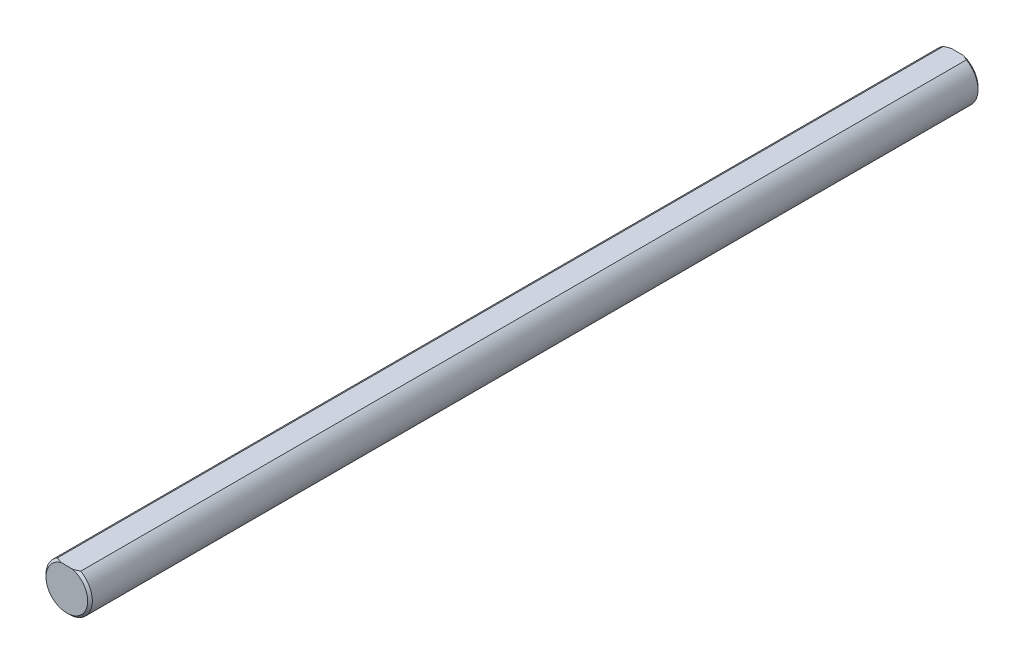
ISO-10303-21;
HEADER;
FILE_DESCRIPTION(('STEP AP214'),'2;1');
FILE_NAME('part.step','',(''),(''),'','','');
FILE_SCHEMA(('AUTOMOTIVE_DESIGN { 1 0 10303 214 1 1 1 1 }'));
ENDSEC;
DATA;
#1=APPLICATION_CONTEXT('core data for automotive mechanical design processes');
#2=APPLICATION_PROTOCOL_DEFINITION('international standard','automotive_design',2000,#1);
#3=PRODUCT_CONTEXT('',#1,'mechanical');
#4=PRODUCT('Part','Part','',(#3));
#5=PRODUCT_RELATED_PRODUCT_CATEGORY('part','',(#4));
#6=PRODUCT_DEFINITION_FORMATION('','',#4);
#7=PRODUCT_DEFINITION_CONTEXT('part definition',#1,'design');
#8=PRODUCT_DEFINITION('design','',#6,#7);
#9=PRODUCT_DEFINITION_SHAPE('','',#8);
#10=(LENGTH_UNIT() NAMED_UNIT(*) SI_UNIT(.MILLI.,.METRE.));
#11=(NAMED_UNIT(*) PLANE_ANGLE_UNIT() SI_UNIT($,.RADIAN.));
#12=(NAMED_UNIT(*) SI_UNIT($,.STERADIAN.) SOLID_ANGLE_UNIT());
#13=UNCERTAINTY_MEASURE_WITH_UNIT(LENGTH_MEASURE(1.E-05),#10,'distance_accuracy_value','');
#14=(GEOMETRIC_REPRESENTATION_CONTEXT(3) GLOBAL_UNCERTAINTY_ASSIGNED_CONTEXT((#13)) GLOBAL_UNIT_ASSIGNED_CONTEXT((#10,
#11,#12)) REPRESENTATION_CONTEXT('',''));
#15=CARTESIAN_POINT('',(0.,0.,0.));
#16=DIRECTION('',(0.,0.,1.));
#17=DIRECTION('',(1.,0.,0.));
#18=AXIS2_PLACEMENT_3D('',#15,#16,#17);
#19=CARTESIAN_POINT('',(0.,0.,152.4));
#20=DIRECTION('',(0.,0.,-1.));
#21=DIRECTION('',(-1.,0.,0.));
#22=AXIS2_PLACEMENT_3D('',#19,#20,#21);
#23=CYLINDRICAL_SURFACE('',#22,7.9375);
#24=DIRECTION('',(0.,0.,1.));
#25=VECTOR('',#24,1.);
#26=CARTESIAN_POINT('',(-3.96875,6.87407664253898,-152.4));
#27=LINE('',#26,#25);
#28=CARTESIAN_POINT('',(-3.96875,6.87407664253898,-151.60625));
#29=VERTEX_POINT('',#28);
#30=CARTESIAN_POINT('',(-3.96875,6.87407664253898,151.60625));
#31=VERTEX_POINT('',#30);
#32=EDGE_CURVE('E81',#29,#31,#27,.T.);
#33=ORIENTED_EDGE('',*,*,#32,.F.);
#34=CARTESIAN_POINT('',(0.,0.,-151.60625));
#35=DIRECTION('',(0.,0.,1.));
#36=DIRECTION('',(1.,0.,0.));
#37=AXIS2_PLACEMENT_3D('',#34,#35,#36);
#38=CIRCLE('',#37,7.9375);
#39=CARTESIAN_POINT('',(3.96875,6.87407664253898,-151.60625));
#40=VERTEX_POINT('',#39);
#41=EDGE_CURVE('E92',#29,#40,#38,.T.);
#42=ORIENTED_EDGE('',*,*,#41,.T.);
#43=DIRECTION('',(0.,0.,1.));
#44=VECTOR('',#43,1.);
#45=CARTESIAN_POINT('',(3.96875,6.87407664253898,-152.4));
#46=LINE('',#45,#44);
#47=CARTESIAN_POINT('',(3.96875,6.87407664253898,151.60625));
#48=VERTEX_POINT('',#47);
#49=EDGE_CURVE('E94',#40,#48,#46,.T.);
#50=ORIENTED_EDGE('',*,*,#49,.T.);
#51=CARTESIAN_POINT('',(0.,0.,151.60625));
#52=DIRECTION('',(0.,0.,1.));
#53=DIRECTION('',(1.,0.,0.));
#54=AXIS2_PLACEMENT_3D('',#51,#52,#53);
#55=CIRCLE('',#54,7.9375);
#56=EDGE_CURVE('E93',#48,#31,#55,.F.);
#57=ORIENTED_EDGE('',*,*,#56,.T.);
#58=EDGE_LOOP('',(#33,#42,#50,#57));
#59=FACE_BOUND('',#58,.T.);
#60=ADVANCED_FACE('F34',(#59),#23,.T.);
#61=CARTESIAN_POINT('',(0.,0.,152.4));
#62=DIRECTION('',(0.,0.,1.));
#63=DIRECTION('',(1.,0.,0.));
#64=AXIS2_PLACEMENT_3D('',#61,#62,#63);
#65=PLANE('',#64);
#66=DIRECTION('',(1.,0.,0.));
#67=VECTOR('',#66,1.);
#68=CARTESIAN_POINT('',(-3.96875,6.87407664253898,152.4));
#69=LINE('',#68,#67);
#70=CARTESIAN_POINT('',(-1.94428248333446,6.87407664253898,152.4));
#71=VERTEX_POINT('',#70);
#72=CARTESIAN_POINT('',(1.94428248333446,6.87407664253898,152.4));
#73=VERTEX_POINT('',#72);
#74=EDGE_CURVE('E139',#71,#73,#69,.T.);
#75=ORIENTED_EDGE('',*,*,#74,.F.);
#76=CARTESIAN_POINT('',(0.,0.,152.4));
#77=DIRECTION('',(0.,0.,1.));
#78=DIRECTION('',(1.,0.,0.));
#79=AXIS2_PLACEMENT_3D('',#76,#77,#78);
#80=CIRCLE('',#79,7.14375000000009);
#81=EDGE_CURVE('E11',#71,#73,#80,.T.);
#82=ORIENTED_EDGE('',*,*,#81,.T.);
#83=EDGE_LOOP('',(#75,#82));
#84=FACE_BOUND('',#83,.T.);
#85=ADVANCED_FACE('F132',(#84),#65,.T.);
#86=CARTESIAN_POINT('',(0.,0.,-152.4));
#87=DIRECTION('',(0.,0.,1.));
#88=DIRECTION('',(1.,0.,0.));
#89=AXIS2_PLACEMENT_3D('',#86,#87,#88);
#90=PLANE('',#89);
#91=DIRECTION('',(1.,0.,0.));
#92=VECTOR('',#91,1.);
#93=CARTESIAN_POINT('',(-3.96875,6.87407664253898,-152.4));
#94=LINE('',#93,#92);
#95=CARTESIAN_POINT('',(-1.94428248333263,6.87407664253898,-152.4));
#96=VERTEX_POINT('',#95);
#97=CARTESIAN_POINT('',(1.94428248333263,6.87407664253898,-152.4));
#98=VERTEX_POINT('',#97);
#99=EDGE_CURVE('E83',#96,#98,#94,.T.);
#100=ORIENTED_EDGE('',*,*,#99,.T.);
#101=CARTESIAN_POINT('',(0.,0.,-152.4));
#102=DIRECTION('',(0.,0.,1.));
#103=DIRECTION('',(1.,0.,0.));
#104=AXIS2_PLACEMENT_3D('',#101,#102,#103);
#105=CIRCLE('',#104,7.14374999999959);
#106=EDGE_CURVE('E43',#98,#96,#105,.F.);
#107=ORIENTED_EDGE('',*,*,#106,.T.);
#108=EDGE_LOOP('',(#100,#107));
#109=FACE_BOUND('',#108,.T.);
#110=ADVANCED_FACE('F113',(#109),#90,.F.);
#111=CARTESIAN_POINT('',(-3.96875,6.87407664253898,-152.4));
#112=DIRECTION('',(0.,-1.,0.));
#113=DIRECTION('',(0.,0.,-1.));
#114=AXIS2_PLACEMENT_3D('',#111,#112,#113);
#115=PLANE('',#114);
#116=ORIENTED_EDGE('',*,*,#49,.F.);
#117=CARTESIAN_POINT('',(3.96875,6.87407664253898,-151.60625));
#118=CARTESIAN_POINT('',(3.80626291748163,6.87407664253898,-151.687470206199));
#119=CARTESIAN_POINT('',(3.64225470595051,6.87407664253898,-151.765754769048));
#120=CARTESIAN_POINT('',(3.31145567692508,6.87407664253898,-151.915064628563));
#121=CARTESIAN_POINT('',(3.14467259719273,6.87407664253898,-151.986107117542));
#122=CARTESIAN_POINT('',(2.80772295006159,6.87407664253898,-152.119980014261));
#123=CARTESIAN_POINT('',(2.63755497590345,6.87407664253898,-152.182806921835));
#124=CARTESIAN_POINT('',(2.29355564196872,6.87407664253898,-152.298955489869));
#125=CARTESIAN_POINT('',(2.11971635818743,6.87407664253898,-152.352253588827));
#126=CARTESIAN_POINT('',(1.94428248333263,6.87407664253898,-152.4));
#127=B_SPLINE_CURVE_WITH_KNOTS('',3,(#117,#118,#119,#120,#121,#122,#123,#124,#125,#126),
.UNSPECIFIED.,.F.,.F.,(4,2,2,2,4),(0.,0.545006421944834,1.08868732474366,1.63259910782753,
2.17783773920298),.UNSPECIFIED.);
#128=EDGE_CURVE('E87',#40,#98,#127,.T.);
#129=ORIENTED_EDGE('',*,*,#128,.T.);
#130=ORIENTED_EDGE('',*,*,#99,.F.);
#131=CARTESIAN_POINT('',(-1.94428248333263,6.87407664253898,-152.4));
#132=CARTESIAN_POINT('',(-2.11971635818743,6.87407664253898,-152.352253588827));
#133=CARTESIAN_POINT('',(-2.29355564196872,6.87407664253898,-152.298955489869));
#134=CARTESIAN_POINT('',(-2.63755497590345,6.87407664253898,-152.182806921835));
#135=CARTESIAN_POINT('',(-2.80772295006159,6.87407664253898,-152.119980014261));
#136=CARTESIAN_POINT('',(-3.14467259719273,6.87407664253898,-151.986107117542));
#137=CARTESIAN_POINT('',(-3.31145567692508,6.87407664253898,-151.915064628563));
#138=CARTESIAN_POINT('',(-3.64225470595051,6.87407664253898,-151.765754769048));
#139=CARTESIAN_POINT('',(-3.80626291748164,6.87407664253898,-151.687470206199));
#140=CARTESIAN_POINT('',(-3.96875000000001,6.87407664253898,-151.60625));
#141=B_SPLINE_CURVE_WITH_KNOTS('',3,(#131,#132,#133,#134,#135,#136,#137,#138,#139,#140),
.UNSPECIFIED.,.F.,.F.,(4,2,2,2,4),(0.,0.545238631375451,1.08915041445932,1.63283131725815,
2.17783773920299),.UNSPECIFIED.);
#142=EDGE_CURVE('E77',#96,#29,#141,.T.);
#143=ORIENTED_EDGE('',*,*,#142,.T.);
#144=ORIENTED_EDGE('',*,*,#32,.T.);
#145=CARTESIAN_POINT('',(-3.96875,6.87407664253898,151.60625));
#146=CARTESIAN_POINT('',(-3.80626291748177,6.87407664253898,151.6874702062));
#147=CARTESIAN_POINT('',(-3.64225470595078,6.87407664253898,151.765754769049));
#148=CARTESIAN_POINT('',(-3.31145567692565,6.87407664253898,151.915064628563));
#149=CARTESIAN_POINT('',(-3.14467259719345,6.87407664253898,151.986107117542));
#150=CARTESIAN_POINT('',(-2.80772295006262,6.87407664253898,152.119980014261));
#151=CARTESIAN_POINT('',(-2.63755497590464,6.87407664253898,152.182806921835));
#152=CARTESIAN_POINT('',(-2.29355564197023,6.87407664253898,152.298955489869));
#153=CARTESIAN_POINT('',(-2.11971635818909,6.87407664253898,152.352253588827));
#154=CARTESIAN_POINT('',(-1.94428248333446,6.87407664253898,152.4));
#155=B_SPLINE_CURVE_WITH_KNOTS('',3,(#145,#146,#147,#148,#149,#150,#151,#152,#153,#154),
.UNSPECIFIED.,.F.,.F.,(4,2,2,2,4),(0.,0.545006421944376,1.08868732474271,1.63259910782611,
2.17783773920107),.UNSPECIFIED.);
#156=EDGE_CURVE('E57',#31,#71,#155,.T.);
#157=ORIENTED_EDGE('',*,*,#156,.T.);
#158=ORIENTED_EDGE('',*,*,#74,.T.);
#159=CARTESIAN_POINT('',(1.94428248333446,6.87407664253898,152.4));
#160=CARTESIAN_POINT('',(2.1197163581891,6.87407664253898,152.352253588827));
#161=CARTESIAN_POINT('',(2.29355564197023,6.87407664253898,152.298955489869));
#162=CARTESIAN_POINT('',(2.63755497590464,6.87407664253898,152.182806921835));
#163=CARTESIAN_POINT('',(2.80772295006262,6.87407664253898,152.119980014261));
#164=CARTESIAN_POINT('',(3.14467259719345,6.87407664253898,151.986107117542));
#165=CARTESIAN_POINT('',(3.31145567692565,6.87407664253898,151.915064628563));
#166=CARTESIAN_POINT('',(3.64225470595078,6.87407664253898,151.765754769049));
#167=CARTESIAN_POINT('',(3.80626291748177,6.87407664253898,151.6874702062));
#168=CARTESIAN_POINT('',(3.96875,6.87407664253898,151.60625));
#169=B_SPLINE_CURVE_WITH_KNOTS('',3,(#159,#160,#161,#162,#163,#164,#165,#166,#167,#168),
.UNSPECIFIED.,.F.,.F.,(4,2,2,2,4),(0.,0.545238631374965,1.08915041445836,1.6328313172567,
2.17783773920107),.UNSPECIFIED.);
#170=EDGE_CURVE('E50',#73,#48,#169,.T.);
#171=ORIENTED_EDGE('',*,*,#170,.T.);
#172=EDGE_LOOP('',(#116,#129,#130,#143,#144,#157,#158,#171));
#173=FACE_BOUND('',#172,.T.);
#174=ADVANCED_FACE('F80',(#173),#115,.F.);
#175=CARTESIAN_POINT('',(0.,0.,-151.60625));
#176=DIRECTION('',(0.,0.,1.));
#177=DIRECTION('',(1.,0.,0.));
#178=AXIS2_PLACEMENT_3D('',#175,#176,#177);
#179=CONICAL_SURFACE('',#178,7.9375,0.785398163397441);
#180=ORIENTED_EDGE('',*,*,#142,.F.);
#181=ORIENTED_EDGE('',*,*,#106,.F.);
#182=ORIENTED_EDGE('',*,*,#128,.F.);
#183=ORIENTED_EDGE('',*,*,#41,.F.);
#184=EDGE_LOOP('',(#180,#181,#182,#183));
#185=FACE_BOUND('',#184,.T.);
#186=ADVANCED_FACE('F96',(#185),#179,.T.);
#187=CARTESIAN_POINT('',(0.,0.,152.4));
#188=DIRECTION('',(0.,0.,-1.));
#189=DIRECTION('',(-1.,0.,0.));
#190=AXIS2_PLACEMENT_3D('',#187,#188,#189);
#191=CONICAL_SURFACE('',#190,7.14375000000009,0.785398163397458);
#192=ORIENTED_EDGE('',*,*,#156,.F.);
#193=ORIENTED_EDGE('',*,*,#56,.F.);
#194=ORIENTED_EDGE('',*,*,#170,.F.);
#195=ORIENTED_EDGE('',*,*,#81,.F.);
#196=EDGE_LOOP('',(#192,#193,#194,#195));
#197=FACE_BOUND('',#196,.T.);
#198=ADVANCED_FACE('F36',(#197),#191,.T.);
#199=CLOSED_SHELL('',(#60,#85,#110,#174,#186,#198));
#200=MANIFOLD_SOLID_BREP('B2',#199);
#201=ADVANCED_BREP_SHAPE_REPRESENTATION('',(#18,#200),#14);
#202=SHAPE_DEFINITION_REPRESENTATION(#9,#201);
ENDSEC;
END-ISO-10303-21;
